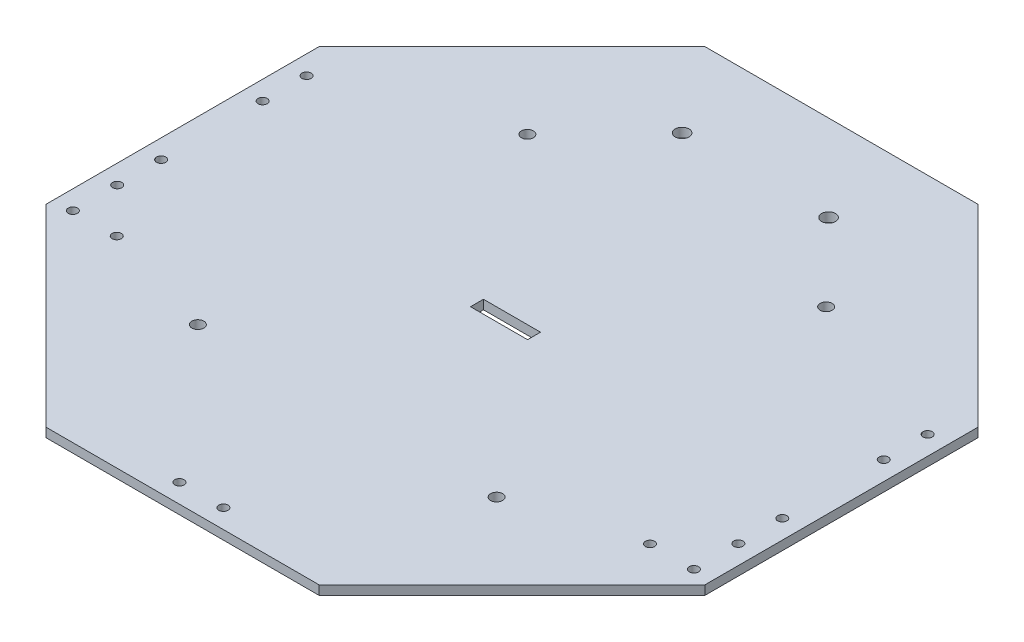
ISO-10303-21;
HEADER;
FILE_DESCRIPTION(('STEP AP214'),'2;1');
FILE_NAME('part.step','',(''),(''),'','','');
FILE_SCHEMA(('AUTOMOTIVE_DESIGN { 1 0 10303 214 1 1 1 1 }'));
ENDSEC;
DATA;
#1=APPLICATION_CONTEXT('core data for automotive mechanical design processes');
#2=APPLICATION_PROTOCOL_DEFINITION('international standard','automotive_design',2000,#1);
#3=PRODUCT_CONTEXT('',#1,'mechanical');
#4=PRODUCT('Part','Part','',(#3));
#5=PRODUCT_RELATED_PRODUCT_CATEGORY('part','',(#4));
#6=PRODUCT_DEFINITION_FORMATION('','',#4);
#7=PRODUCT_DEFINITION_CONTEXT('part definition',#1,'design');
#8=PRODUCT_DEFINITION('design','',#6,#7);
#9=PRODUCT_DEFINITION_SHAPE('','',#8);
#10=(LENGTH_UNIT() NAMED_UNIT(*) SI_UNIT(.MILLI.,.METRE.));
#11=(NAMED_UNIT(*) PLANE_ANGLE_UNIT() SI_UNIT($,.RADIAN.));
#12=(NAMED_UNIT(*) SI_UNIT($,.STERADIAN.) SOLID_ANGLE_UNIT());
#13=UNCERTAINTY_MEASURE_WITH_UNIT(LENGTH_MEASURE(1.E-05),#10,'distance_accuracy_value','');
#14=(GEOMETRIC_REPRESENTATION_CONTEXT(3) GLOBAL_UNCERTAINTY_ASSIGNED_CONTEXT((#13)) GLOBAL_UNIT_ASSIGNED_CONTEXT((#10,
#11,#12)) REPRESENTATION_CONTEXT('',''));
#15=CARTESIAN_POINT('',(0.,0.,0.));
#16=DIRECTION('',(0.,0.,1.));
#17=DIRECTION('',(1.,0.,0.));
#18=AXIS2_PLACEMENT_3D('',#15,#16,#17);
#19=CARTESIAN_POINT('',(0.,3.175,0.));
#20=DIRECTION('',(0.,-1.,0.));
#21=DIRECTION('',(0.,0.,-1.));
#22=AXIS2_PLACEMENT_3D('',#19,#20,#21);
#23=PLANE('',#22);
#24=CARTESIAN_POINT('',(50.8,3.175,-154.263560488309));
#25=DIRECTION('',(0.,1.,0.));
#26=DIRECTION('',(0.,0.,1.));
#27=AXIS2_PLACEMENT_3D('',#24,#25,#26);
#28=CIRCLE('',#27,2.41300000000001);
#29=CARTESIAN_POINT('',(50.8,3.175,-151.850560488309));
#30=VERTEX_POINT('',#29);
#31=EDGE_CURVE('E500',#30,#30,#28,.T.);
#32=ORIENTED_EDGE('',*,*,#31,.F.);
#33=EDGE_LOOP('',(#32));
#34=FACE_BOUND('',#33,.T.);
#35=CARTESIAN_POINT('',(101.6,3.175,-154.263560488309));
#36=DIRECTION('',(0.,1.,0.));
#37=DIRECTION('',(0.,0.,-1.));
#38=AXIS2_PLACEMENT_3D('',#35,#36,#37);
#39=CIRCLE('',#38,2.41300000000001);
#40=CARTESIAN_POINT('',(101.6,3.175,-156.676560488309));
#41=VERTEX_POINT('',#40);
#42=EDGE_CURVE('E146',#41,#41,#39,.T.);
#43=ORIENTED_EDGE('',*,*,#42,.F.);
#44=EDGE_LOOP('',(#43));
#45=FACE_BOUND('',#44,.T.);
#46=DIRECTION('',(1.,0.,0.));
#47=VECTOR('',#46,1.);
#48=CARTESIAN_POINT('',(86.1,3.175,-65.35));
#49=LINE('',#48,#47);
#50=CARTESIAN_POINT('',(66.3,3.175,-65.35));
#51=VERTEX_POINT('',#50);
#52=CARTESIAN_POINT('',(86.1,3.175,-65.35));
#53=VERTEX_POINT('',#52);
#54=EDGE_CURVE('E152',#51,#53,#49,.T.);
#55=ORIENTED_EDGE('',*,*,#54,.F.);
#56=DIRECTION('',(0.,0.,1.));
#57=VECTOR('',#56,1.);
#58=CARTESIAN_POINT('',(66.3,3.175,-69.85));
#59=LINE('',#58,#57);
#60=CARTESIAN_POINT('',(66.3,3.175,-69.85));
#61=VERTEX_POINT('',#60);
#62=EDGE_CURVE('E48',#61,#51,#59,.T.);
#63=ORIENTED_EDGE('',*,*,#62,.F.);
#64=DIRECTION('',(-1.,0.,0.));
#65=VECTOR('',#64,1.);
#66=CARTESIAN_POINT('',(86.1,3.175,-69.85));
#67=LINE('',#66,#65);
#68=CARTESIAN_POINT('',(86.1,3.175,-69.85));
#69=VERTEX_POINT('',#68);
#70=EDGE_CURVE('E140',#69,#61,#67,.T.);
#71=ORIENTED_EDGE('',*,*,#70,.F.);
#72=DIRECTION('',(0.,0.,-1.));
#73=VECTOR('',#72,1.);
#74=CARTESIAN_POINT('',(86.1,3.175,-69.85));
#75=LINE('',#74,#73);
#76=EDGE_CURVE('E143',#53,#69,#75,.T.);
#77=ORIENTED_EDGE('',*,*,#76,.F.);
#78=EDGE_LOOP('',(#55,#63,#71,#77));
#79=FACE_BOUND('',#78,.T.);
#80=CARTESIAN_POINT('',(-31.5214,3.175,-106.313101445706));
#81=DIRECTION('',(0.,1.,0.));
#82=DIRECTION('',(0.,0.,1.));
#83=AXIS2_PLACEMENT_3D('',#80,#81,#82);
#84=CIRCLE('',#83,1.59999999999999);
#85=CARTESIAN_POINT('',(-31.5214,3.175,-104.713101445706));
#86=VERTEX_POINT('',#85);
#87=EDGE_CURVE('E159',#86,#86,#84,.T.);
#88=ORIENTED_EDGE('',*,*,#87,.F.);
#89=EDGE_LOOP('',(#88));
#90=FACE_BOUND('',#89,.T.);
#91=CARTESIAN_POINT('',(-31.5214,3.175,-91.0731014457063));
#92=DIRECTION('',(0.,1.,0.));
#93=DIRECTION('',(0.,0.,1.));
#94=AXIS2_PLACEMENT_3D('',#91,#92,#93);
#95=CIRCLE('',#94,1.59999999999999);
#96=CARTESIAN_POINT('',(-31.5214,3.175,-89.4731014457063));
#97=VERTEX_POINT('',#96);
#98=EDGE_CURVE('E168',#97,#97,#95,.T.);
#99=ORIENTED_EDGE('',*,*,#98,.F.);
#100=EDGE_LOOP('',(#99));
#101=FACE_BOUND('',#100,.T.);
#102=CARTESIAN_POINT('',(-31.5214,3.175,-55.879553600485));
#103=DIRECTION('',(0.,1.,0.));
#104=DIRECTION('',(0.,0.,1.));
#105=AXIS2_PLACEMENT_3D('',#102,#103,#104);
#106=CIRCLE('',#105,1.59999999999999);
#107=CARTESIAN_POINT('',(-31.5214,3.175,-54.2795536004851));
#108=VERTEX_POINT('',#107);
#109=EDGE_CURVE('E174',#108,#108,#106,.T.);
#110=ORIENTED_EDGE('',*,*,#109,.F.);
#111=EDGE_LOOP('',(#110));
#112=FACE_BOUND('',#111,.T.);
#113=CARTESIAN_POINT('',(-31.5214,3.175,-40.6395536004851));
#114=DIRECTION('',(0.,1.,0.));
#115=DIRECTION('',(0.,0.,1.));
#116=AXIS2_PLACEMENT_3D('',#113,#114,#115);
#117=CIRCLE('',#116,1.59999999999999);
#118=CARTESIAN_POINT('',(-31.5214,3.175,-39.0395536004851));
#119=VERTEX_POINT('',#118);
#120=EDGE_CURVE('E180',#119,#119,#117,.T.);
#121=ORIENTED_EDGE('',*,*,#120,.F.);
#122=EDGE_LOOP('',(#121));
#123=FACE_BOUND('',#122,.T.);
#124=CARTESIAN_POINT('',(-31.5214,3.175,-25.2303351621829));
#125=DIRECTION('',(0.,1.,0.));
#126=DIRECTION('',(0.,0.,1.));
#127=AXIS2_PLACEMENT_3D('',#124,#125,#126);
#128=CIRCLE('',#127,1.59999999999999);
#129=CARTESIAN_POINT('',(-31.5214,3.175,-23.6303351621829));
#130=VERTEX_POINT('',#129);
#131=EDGE_CURVE('E186',#130,#130,#128,.T.);
#132=ORIENTED_EDGE('',*,*,#131,.F.);
#133=EDGE_LOOP('',(#132));
#134=FACE_BOUND('',#133,.T.);
#135=CARTESIAN_POINT('',(-16.2814,3.175,-25.2303351621829));
#136=DIRECTION('',(0.,1.,0.));
#137=DIRECTION('',(0.,0.,1.));
#138=AXIS2_PLACEMENT_3D('',#135,#136,#137);
#139=CIRCLE('',#138,1.59999999999999);
#140=CARTESIAN_POINT('',(-16.2814,3.175,-23.6303351621829));
#141=VERTEX_POINT('',#140);
#142=EDGE_CURVE('E192',#141,#141,#139,.T.);
#143=ORIENTED_EDGE('',*,*,#142,.F.);
#144=EDGE_LOOP('',(#143));
#145=FACE_BOUND('',#144,.T.);
#146=CARTESIAN_POINT('',(68.58,3.175,37.8714));
#147=DIRECTION('',(0.,1.,0.));
#148=DIRECTION('',(0.,0.,1.));
#149=AXIS2_PLACEMENT_3D('',#146,#147,#148);
#150=CIRCLE('',#149,1.59999999999999);
#151=CARTESIAN_POINT('',(68.58,3.175,39.4714));
#152=VERTEX_POINT('',#151);
#153=EDGE_CURVE('E198',#152,#152,#150,.T.);
#154=ORIENTED_EDGE('',*,*,#153,.F.);
#155=EDGE_LOOP('',(#154));
#156=FACE_BOUND('',#155,.T.);
#157=CARTESIAN_POINT('',(83.8200000000001,3.175,37.8714));
#158=DIRECTION('',(0.,1.,0.));
#159=DIRECTION('',(0.,0.,1.));
#160=AXIS2_PLACEMENT_3D('',#157,#158,#159);
#161=CIRCLE('',#160,1.59999999999999);
#162=CARTESIAN_POINT('',(83.8200000000001,3.175,39.4714));
#163=VERTEX_POINT('',#162);
#164=EDGE_CURVE('E204',#163,#163,#161,.T.);
#165=ORIENTED_EDGE('',*,*,#164,.F.);
#166=EDGE_LOOP('',(#165));
#167=FACE_BOUND('',#166,.T.);
#168=CARTESIAN_POINT('',(183.9214,3.175,-25.2303351621829));
#169=DIRECTION('',(0.,1.,0.));
#170=DIRECTION('',(0.,0.,1.));
#171=AXIS2_PLACEMENT_3D('',#168,#169,#170);
#172=CIRCLE('',#171,1.59999999999999);
#173=CARTESIAN_POINT('',(183.9214,3.175,-23.6303351621829));
#174=VERTEX_POINT('',#173);
#175=EDGE_CURVE('E210',#174,#174,#172,.T.);
#176=ORIENTED_EDGE('',*,*,#175,.F.);
#177=EDGE_LOOP('',(#176));
#178=FACE_BOUND('',#177,.T.);
#179=CARTESIAN_POINT('',(168.6814,3.175,-25.2303351621829));
#180=DIRECTION('',(0.,1.,0.));
#181=DIRECTION('',(0.,0.,1.));
#182=AXIS2_PLACEMENT_3D('',#179,#180,#181);
#183=CIRCLE('',#182,1.59999999999999);
#184=CARTESIAN_POINT('',(168.6814,3.175,-23.6303351621829));
#185=VERTEX_POINT('',#184);
#186=EDGE_CURVE('E216',#185,#185,#183,.T.);
#187=ORIENTED_EDGE('',*,*,#186,.F.);
#188=EDGE_LOOP('',(#187));
#189=FACE_BOUND('',#188,.T.);
#190=CARTESIAN_POINT('',(183.9214,3.175,-40.639553600485));
#191=DIRECTION('',(0.,1.,0.));
#192=DIRECTION('',(0.,0.,1.));
#193=AXIS2_PLACEMENT_3D('',#190,#191,#192);
#194=CIRCLE('',#193,1.59999999999999);
#195=CARTESIAN_POINT('',(183.9214,3.175,-39.039553600485));
#196=VERTEX_POINT('',#195);
#197=EDGE_CURVE('E222',#196,#196,#194,.T.);
#198=ORIENTED_EDGE('',*,*,#197,.F.);
#199=EDGE_LOOP('',(#198));
#200=FACE_BOUND('',#199,.T.);
#201=CARTESIAN_POINT('',(183.9214,3.175,-55.879553600485));
#202=DIRECTION('',(0.,1.,0.));
#203=DIRECTION('',(0.,0.,1.));
#204=AXIS2_PLACEMENT_3D('',#201,#202,#203);
#205=CIRCLE('',#204,1.59999999999999);
#206=CARTESIAN_POINT('',(183.9214,3.175,-54.279553600485));
#207=VERTEX_POINT('',#206);
#208=EDGE_CURVE('E228',#207,#207,#205,.T.);
#209=ORIENTED_EDGE('',*,*,#208,.F.);
#210=EDGE_LOOP('',(#209));
#211=FACE_BOUND('',#210,.T.);
#212=CARTESIAN_POINT('',(183.9214,3.175,-91.0731014457062));
#213=DIRECTION('',(0.,1.,0.));
#214=DIRECTION('',(0.,0.,1.));
#215=AXIS2_PLACEMENT_3D('',#212,#213,#214);
#216=CIRCLE('',#215,1.59999999999999);
#217=CARTESIAN_POINT('',(183.9214,3.175,-89.4731014457062));
#218=VERTEX_POINT('',#217);
#219=EDGE_CURVE('E234',#218,#218,#216,.T.);
#220=ORIENTED_EDGE('',*,*,#219,.F.);
#221=EDGE_LOOP('',(#220));
#222=FACE_BOUND('',#221,.T.);
#223=CARTESIAN_POINT('',(183.9214,3.175,-106.313101445706));
#224=DIRECTION('',(0.,1.,0.));
#225=DIRECTION('',(0.,0.,1.));
#226=AXIS2_PLACEMENT_3D('',#223,#224,#225);
#227=CIRCLE('',#226,1.59999999999999);
#228=CARTESIAN_POINT('',(183.9214,3.175,-104.713101445706));
#229=VERTEX_POINT('',#228);
#230=EDGE_CURVE('E240',#229,#229,#227,.T.);
#231=ORIENTED_EDGE('',*,*,#230,.F.);
#232=EDGE_LOOP('',(#231));
#233=FACE_BOUND('',#232,.T.);
#234=DIRECTION('',(-0.707106781186548,0.,-0.707106781186548));
#235=VECTOR('',#234,1.);
#236=CARTESIAN_POINT('',(123.544610179245,3.175,-184.15));
#237=LINE('',#236,#235);
#238=CARTESIAN_POINT('',(190.5,3.175,-117.194610179245));
#239=VERTEX_POINT('',#238);
#240=CARTESIAN_POINT('',(123.544610179245,3.175,-184.15));
#241=VERTEX_POINT('',#240);
#242=EDGE_CURVE('E271',#239,#241,#237,.T.);
#243=ORIENTED_EDGE('',*,*,#242,.T.);
#244=DIRECTION('',(-1.,0.,0.));
#245=VECTOR('',#244,1.);
#246=CARTESIAN_POINT('',(28.8553898207553,3.175,-184.15));
#247=LINE('',#246,#245);
#248=CARTESIAN_POINT('',(28.8553898207553,3.175,-184.15));
#249=VERTEX_POINT('',#248);
#250=EDGE_CURVE('E274',#241,#249,#247,.T.);
#251=ORIENTED_EDGE('',*,*,#250,.T.);
#252=DIRECTION('',(-0.707106781186548,0.,0.707106781186547));
#253=VECTOR('',#252,1.);
#254=CARTESIAN_POINT('',(28.8553898207553,3.175,-184.15));
#255=LINE('',#254,#253);
#256=CARTESIAN_POINT('',(-38.1,3.175,-117.194610179245));
#257=VERTEX_POINT('',#256);
#258=EDGE_CURVE('E277',#249,#257,#255,.T.);
#259=ORIENTED_EDGE('',*,*,#258,.T.);
#260=DIRECTION('',(0.,0.,1.));
#261=VECTOR('',#260,1.);
#262=CARTESIAN_POINT('',(-38.1,3.175,-22.5053898207552));
#263=LINE('',#262,#261);
#264=CARTESIAN_POINT('',(-38.1,3.175,-22.5053898207552));
#265=VERTEX_POINT('',#264);
#266=EDGE_CURVE('E279',#257,#265,#263,.T.);
#267=ORIENTED_EDGE('',*,*,#266,.T.);
#268=DIRECTION('',(0.707106781186548,0.,0.707106781186548));
#269=VECTOR('',#268,1.);
#270=CARTESIAN_POINT('',(-38.1,3.175,-22.5053898207552));
#271=LINE('',#270,#269);
#272=CARTESIAN_POINT('',(28.8553898207553,3.175,44.45));
#273=VERTEX_POINT('',#272);
#274=EDGE_CURVE('E281',#265,#273,#271,.T.);
#275=ORIENTED_EDGE('',*,*,#274,.T.);
#276=DIRECTION('',(1.,0.,0.));
#277=VECTOR('',#276,1.);
#278=CARTESIAN_POINT('',(28.8553898207553,3.175,44.45));
#279=LINE('',#278,#277);
#280=CARTESIAN_POINT('',(123.544610179245,3.175,44.45));
#281=VERTEX_POINT('',#280);
#282=EDGE_CURVE('E283',#273,#281,#279,.T.);
#283=ORIENTED_EDGE('',*,*,#282,.T.);
#284=DIRECTION('',(0.707106781186545,0.,-0.70710678118655));
#285=VECTOR('',#284,1.);
#286=CARTESIAN_POINT('',(131.544610179245,3.175,36.45));
#287=LINE('',#286,#285);
#288=CARTESIAN_POINT('',(190.5,3.175,-22.5053898207552));
#289=VERTEX_POINT('',#288);
#290=EDGE_CURVE('E285',#281,#289,#287,.T.);
#291=ORIENTED_EDGE('',*,*,#290,.T.);
#292=DIRECTION('',(0.,0.,-1.));
#293=VECTOR('',#292,1.);
#294=CARTESIAN_POINT('',(190.5,3.175,-22.5053898207552));
#295=LINE('',#294,#293);
#296=EDGE_CURVE('E287',#289,#239,#295,.T.);
#297=ORIENTED_EDGE('',*,*,#296,.T.);
#298=EDGE_LOOP('',(#243,#251,#259,#267,#275,#283,#291,#297));
#299=FACE_BOUND('',#298,.T.);
#300=CARTESIAN_POINT('',(24.384,3.175,-12.7));
#301=DIRECTION('',(0.,1.,0.));
#302=DIRECTION('',(0.,0.,1.));
#303=AXIS2_PLACEMENT_3D('',#300,#301,#302);
#304=CIRCLE('',#303,2.0828);
#305=CARTESIAN_POINT('',(24.384,3.175,-10.6172));
#306=VERTEX_POINT('',#305);
#307=EDGE_CURVE('E265',#306,#306,#304,.T.);
#308=ORIENTED_EDGE('',*,*,#307,.F.);
#309=EDGE_LOOP('',(#308));
#310=FACE_BOUND('',#309,.T.);
#311=CARTESIAN_POINT('',(128.016,3.175,-12.7));
#312=DIRECTION('',(0.,1.,0.));
#313=DIRECTION('',(0.,0.,-1.));
#314=AXIS2_PLACEMENT_3D('',#311,#312,#313);
#315=CIRCLE('',#314,2.08279999999999);
#316=CARTESIAN_POINT('',(128.016,3.175,-14.7828));
#317=VERTEX_POINT('',#316);
#318=EDGE_CURVE('E259',#317,#317,#315,.T.);
#319=ORIENTED_EDGE('',*,*,#318,.F.);
#320=EDGE_LOOP('',(#319));
#321=FACE_BOUND('',#320,.T.);
#322=CARTESIAN_POINT('',(128.016,3.175,-127.));
#323=DIRECTION('',(0.,1.,0.));
#324=DIRECTION('',(0.,0.,1.));
#325=AXIS2_PLACEMENT_3D('',#322,#323,#324);
#326=CIRCLE('',#325,2.08279999999998);
#327=CARTESIAN_POINT('',(128.016,3.175,-124.9172));
#328=VERTEX_POINT('',#327);
#329=EDGE_CURVE('E253',#328,#328,#326,.T.);
#330=ORIENTED_EDGE('',*,*,#329,.F.);
#331=EDGE_LOOP('',(#330));
#332=FACE_BOUND('',#331,.T.);
#333=CARTESIAN_POINT('',(24.384,3.175,-127.));
#334=DIRECTION('',(0.,1.,0.));
#335=DIRECTION('',(0.,0.,-1.));
#336=AXIS2_PLACEMENT_3D('',#333,#334,#335);
#337=CIRCLE('',#336,2.08279999999999);
#338=CARTESIAN_POINT('',(24.384,3.175,-129.0828));
#339=VERTEX_POINT('',#338);
#340=EDGE_CURVE('E247',#339,#339,#337,.T.);
#341=ORIENTED_EDGE('',*,*,#340,.F.);
#342=EDGE_LOOP('',(#341));
#343=FACE_BOUND('',#342,.T.);
#344=ADVANCED_FACE('F33',(#34,#45,#79,#90,#101,#112,#123,#134,#145,#156,#167,#178,#189,#200,
#211,#222,#233,#299,#310,#321,#332,#343),#23,.F.);
#345=CARTESIAN_POINT('',(0.,0.,0.));
#346=DIRECTION('',(0.,-1.,0.));
#347=DIRECTION('',(0.,0.,-1.));
#348=AXIS2_PLACEMENT_3D('',#345,#346,#347);
#349=PLANE('',#348);
#350=CARTESIAN_POINT('',(50.8,0.,-154.263560488309));
#351=DIRECTION('',(0.,1.,0.));
#352=DIRECTION('',(0.,0.,1.));
#353=AXIS2_PLACEMENT_3D('',#350,#351,#352);
#354=CIRCLE('',#353,2.41300000000001);
#355=CARTESIAN_POINT('',(50.8,0.,-151.850560488309));
#356=VERTEX_POINT('',#355);
#357=EDGE_CURVE('E153',#356,#356,#354,.T.);
#358=ORIENTED_EDGE('',*,*,#357,.T.);
#359=EDGE_LOOP('',(#358));
#360=FACE_BOUND('',#359,.T.);
#361=CARTESIAN_POINT('',(101.6,0.,-154.263560488309));
#362=DIRECTION('',(0.,1.,0.));
#363=DIRECTION('',(0.,0.,-1.));
#364=AXIS2_PLACEMENT_3D('',#361,#362,#363);
#365=CIRCLE('',#364,2.41300000000001);
#366=CARTESIAN_POINT('',(101.6,0.,-156.676560488309));
#367=VERTEX_POINT('',#366);
#368=EDGE_CURVE('E501',#367,#367,#365,.T.);
#369=ORIENTED_EDGE('',*,*,#368,.T.);
#370=EDGE_LOOP('',(#369));
#371=FACE_BOUND('',#370,.T.);
#372=DIRECTION('',(0.,0.,1.));
#373=VECTOR('',#372,1.);
#374=CARTESIAN_POINT('',(66.3,0.,-69.85));
#375=LINE('',#374,#373);
#376=CARTESIAN_POINT('',(66.3,0.,-69.85));
#377=VERTEX_POINT('',#376);
#378=CARTESIAN_POINT('',(66.3,0.,-65.35));
#379=VERTEX_POINT('',#378);
#380=EDGE_CURVE('E124',#377,#379,#375,.T.);
#381=ORIENTED_EDGE('',*,*,#380,.T.);
#382=DIRECTION('',(1.,0.,0.));
#383=VECTOR('',#382,1.);
#384=CARTESIAN_POINT('',(86.1,0.,-65.35));
#385=LINE('',#384,#383);
#386=CARTESIAN_POINT('',(86.1,0.,-65.35));
#387=VERTEX_POINT('',#386);
#388=EDGE_CURVE('E133',#379,#387,#385,.T.);
#389=ORIENTED_EDGE('',*,*,#388,.T.);
#390=DIRECTION('',(0.,0.,-1.));
#391=VECTOR('',#390,1.);
#392=CARTESIAN_POINT('',(86.1,0.,-69.85));
#393=LINE('',#392,#391);
#394=CARTESIAN_POINT('',(86.1,0.,-69.85));
#395=VERTEX_POINT('',#394);
#396=EDGE_CURVE('E56',#387,#395,#393,.T.);
#397=ORIENTED_EDGE('',*,*,#396,.T.);
#398=DIRECTION('',(-1.,0.,0.));
#399=VECTOR('',#398,1.);
#400=CARTESIAN_POINT('',(86.1,0.,-69.85));
#401=LINE('',#400,#399);
#402=EDGE_CURVE('E130',#395,#377,#401,.T.);
#403=ORIENTED_EDGE('',*,*,#402,.T.);
#404=EDGE_LOOP('',(#381,#389,#397,#403));
#405=FACE_BOUND('',#404,.T.);
#406=CARTESIAN_POINT('',(-31.5214,0.,-106.313101445706));
#407=DIRECTION('',(0.,1.,0.));
#408=DIRECTION('',(0.,0.,1.));
#409=AXIS2_PLACEMENT_3D('',#406,#407,#408);
#410=CIRCLE('',#409,1.6);
#411=CARTESIAN_POINT('',(-31.5214,0.,-104.713101445706));
#412=VERTEX_POINT('',#411);
#413=EDGE_CURVE('E165',#412,#412,#410,.T.);
#414=ORIENTED_EDGE('',*,*,#413,.T.);
#415=EDGE_LOOP('',(#414));
#416=FACE_BOUND('',#415,.T.);
#417=CARTESIAN_POINT('',(-31.5214,0.,-91.0731014457063));
#418=DIRECTION('',(0.,1.,0.));
#419=DIRECTION('',(0.,0.,1.));
#420=AXIS2_PLACEMENT_3D('',#417,#418,#419);
#421=CIRCLE('',#420,1.6);
#422=CARTESIAN_POINT('',(-31.5214,0.,-89.4731014457063));
#423=VERTEX_POINT('',#422);
#424=EDGE_CURVE('E171',#423,#423,#421,.T.);
#425=ORIENTED_EDGE('',*,*,#424,.T.);
#426=EDGE_LOOP('',(#425));
#427=FACE_BOUND('',#426,.T.);
#428=CARTESIAN_POINT('',(-31.5214,0.,-55.879553600485));
#429=DIRECTION('',(0.,1.,0.));
#430=DIRECTION('',(0.,0.,1.));
#431=AXIS2_PLACEMENT_3D('',#428,#429,#430);
#432=CIRCLE('',#431,1.6);
#433=CARTESIAN_POINT('',(-31.5214,0.,-54.279553600485));
#434=VERTEX_POINT('',#433);
#435=EDGE_CURVE('E177',#434,#434,#432,.T.);
#436=ORIENTED_EDGE('',*,*,#435,.T.);
#437=EDGE_LOOP('',(#436));
#438=FACE_BOUND('',#437,.T.);
#439=CARTESIAN_POINT('',(-31.5214,0.,-40.6395536004851));
#440=DIRECTION('',(0.,1.,0.));
#441=DIRECTION('',(0.,0.,1.));
#442=AXIS2_PLACEMENT_3D('',#439,#440,#441);
#443=CIRCLE('',#442,1.6);
#444=CARTESIAN_POINT('',(-31.5214,0.,-39.0395536004851));
#445=VERTEX_POINT('',#444);
#446=EDGE_CURVE('E183',#445,#445,#443,.T.);
#447=ORIENTED_EDGE('',*,*,#446,.T.);
#448=EDGE_LOOP('',(#447));
#449=FACE_BOUND('',#448,.T.);
#450=CARTESIAN_POINT('',(-31.5214,0.,-25.2303351621829));
#451=DIRECTION('',(0.,1.,0.));
#452=DIRECTION('',(0.,0.,1.));
#453=AXIS2_PLACEMENT_3D('',#450,#451,#452);
#454=CIRCLE('',#453,1.6);
#455=CARTESIAN_POINT('',(-31.5214,0.,-23.6303351621829));
#456=VERTEX_POINT('',#455);
#457=EDGE_CURVE('E189',#456,#456,#454,.T.);
#458=ORIENTED_EDGE('',*,*,#457,.T.);
#459=EDGE_LOOP('',(#458));
#460=FACE_BOUND('',#459,.T.);
#461=CARTESIAN_POINT('',(-16.2814,0.,-25.2303351621829));
#462=DIRECTION('',(0.,1.,0.));
#463=DIRECTION('',(0.,0.,1.));
#464=AXIS2_PLACEMENT_3D('',#461,#462,#463);
#465=CIRCLE('',#464,1.6);
#466=CARTESIAN_POINT('',(-16.2814,0.,-23.6303351621829));
#467=VERTEX_POINT('',#466);
#468=EDGE_CURVE('E195',#467,#467,#465,.T.);
#469=ORIENTED_EDGE('',*,*,#468,.T.);
#470=EDGE_LOOP('',(#469));
#471=FACE_BOUND('',#470,.T.);
#472=CARTESIAN_POINT('',(68.58,0.,37.8714));
#473=DIRECTION('',(0.,1.,0.));
#474=DIRECTION('',(0.,0.,1.));
#475=AXIS2_PLACEMENT_3D('',#472,#473,#474);
#476=CIRCLE('',#475,1.6);
#477=CARTESIAN_POINT('',(68.58,0.,39.4714));
#478=VERTEX_POINT('',#477);
#479=EDGE_CURVE('E201',#478,#478,#476,.T.);
#480=ORIENTED_EDGE('',*,*,#479,.T.);
#481=EDGE_LOOP('',(#480));
#482=FACE_BOUND('',#481,.T.);
#483=CARTESIAN_POINT('',(83.8200000000001,0.,37.8714));
#484=DIRECTION('',(0.,1.,0.));
#485=DIRECTION('',(0.,0.,1.));
#486=AXIS2_PLACEMENT_3D('',#483,#484,#485);
#487=CIRCLE('',#486,1.6);
#488=CARTESIAN_POINT('',(83.8200000000001,0.,39.4714));
#489=VERTEX_POINT('',#488);
#490=EDGE_CURVE('E207',#489,#489,#487,.T.);
#491=ORIENTED_EDGE('',*,*,#490,.T.);
#492=EDGE_LOOP('',(#491));
#493=FACE_BOUND('',#492,.T.);
#494=CARTESIAN_POINT('',(183.9214,0.,-25.2303351621829));
#495=DIRECTION('',(0.,1.,0.));
#496=DIRECTION('',(0.,0.,1.));
#497=AXIS2_PLACEMENT_3D('',#494,#495,#496);
#498=CIRCLE('',#497,1.59999999999999);
#499=CARTESIAN_POINT('',(183.9214,0.,-23.6303351621829));
#500=VERTEX_POINT('',#499);
#501=EDGE_CURVE('E213',#500,#500,#498,.T.);
#502=ORIENTED_EDGE('',*,*,#501,.T.);
#503=EDGE_LOOP('',(#502));
#504=FACE_BOUND('',#503,.T.);
#505=CARTESIAN_POINT('',(168.6814,0.,-25.2303351621829));
#506=DIRECTION('',(0.,1.,0.));
#507=DIRECTION('',(0.,0.,1.));
#508=AXIS2_PLACEMENT_3D('',#505,#506,#507);
#509=CIRCLE('',#508,1.59999999999999);
#510=CARTESIAN_POINT('',(168.6814,0.,-23.6303351621829));
#511=VERTEX_POINT('',#510);
#512=EDGE_CURVE('E219',#511,#511,#509,.T.);
#513=ORIENTED_EDGE('',*,*,#512,.T.);
#514=EDGE_LOOP('',(#513));
#515=FACE_BOUND('',#514,.T.);
#516=CARTESIAN_POINT('',(183.9214,0.,-40.639553600485));
#517=DIRECTION('',(0.,1.,0.));
#518=DIRECTION('',(0.,0.,1.));
#519=AXIS2_PLACEMENT_3D('',#516,#517,#518);
#520=CIRCLE('',#519,1.59999999999999);
#521=CARTESIAN_POINT('',(183.9214,0.,-39.039553600485));
#522=VERTEX_POINT('',#521);
#523=EDGE_CURVE('E225',#522,#522,#520,.T.);
#524=ORIENTED_EDGE('',*,*,#523,.T.);
#525=EDGE_LOOP('',(#524));
#526=FACE_BOUND('',#525,.T.);
#527=CARTESIAN_POINT('',(183.9214,0.,-55.879553600485));
#528=DIRECTION('',(0.,1.,0.));
#529=DIRECTION('',(0.,0.,1.));
#530=AXIS2_PLACEMENT_3D('',#527,#528,#529);
#531=CIRCLE('',#530,1.59999999999999);
#532=CARTESIAN_POINT('',(183.9214,0.,-54.279553600485));
#533=VERTEX_POINT('',#532);
#534=EDGE_CURVE('E231',#533,#533,#531,.T.);
#535=ORIENTED_EDGE('',*,*,#534,.T.);
#536=EDGE_LOOP('',(#535));
#537=FACE_BOUND('',#536,.T.);
#538=CARTESIAN_POINT('',(183.9214,0.,-91.0731014457062));
#539=DIRECTION('',(0.,1.,0.));
#540=DIRECTION('',(0.,0.,1.));
#541=AXIS2_PLACEMENT_3D('',#538,#539,#540);
#542=CIRCLE('',#541,1.59999999999999);
#543=CARTESIAN_POINT('',(183.9214,0.,-89.4731014457062));
#544=VERTEX_POINT('',#543);
#545=EDGE_CURVE('E237',#544,#544,#542,.T.);
#546=ORIENTED_EDGE('',*,*,#545,.T.);
#547=EDGE_LOOP('',(#546));
#548=FACE_BOUND('',#547,.T.);
#549=CARTESIAN_POINT('',(183.9214,0.,-106.313101445706));
#550=DIRECTION('',(0.,1.,0.));
#551=DIRECTION('',(0.,0.,1.));
#552=AXIS2_PLACEMENT_3D('',#549,#550,#551);
#553=CIRCLE('',#552,1.59999999999999);
#554=CARTESIAN_POINT('',(183.9214,0.,-104.713101445706));
#555=VERTEX_POINT('',#554);
#556=EDGE_CURVE('E243',#555,#555,#553,.T.);
#557=ORIENTED_EDGE('',*,*,#556,.T.);
#558=EDGE_LOOP('',(#557));
#559=FACE_BOUND('',#558,.T.);
#560=CARTESIAN_POINT('',(128.016,0.,-127.));
#561=DIRECTION('',(0.,1.,0.));
#562=DIRECTION('',(0.,0.,1.));
#563=AXIS2_PLACEMENT_3D('',#560,#561,#562);
#564=CIRCLE('',#563,2.08279999999998);
#565=CARTESIAN_POINT('',(128.016,0.,-124.9172));
#566=VERTEX_POINT('',#565);
#567=EDGE_CURVE('E250',#566,#566,#564,.T.);
#568=ORIENTED_EDGE('',*,*,#567,.T.);
#569=EDGE_LOOP('',(#568));
#570=FACE_BOUND('',#569,.T.);
#571=CARTESIAN_POINT('',(24.384,0.,-12.7));
#572=DIRECTION('',(0.,1.,0.));
#573=DIRECTION('',(0.,0.,1.));
#574=AXIS2_PLACEMENT_3D('',#571,#572,#573);
#575=CIRCLE('',#574,2.0828);
#576=CARTESIAN_POINT('',(24.384,0.,-10.6172));
#577=VERTEX_POINT('',#576);
#578=EDGE_CURVE('E262',#577,#577,#575,.T.);
#579=ORIENTED_EDGE('',*,*,#578,.T.);
#580=EDGE_LOOP('',(#579));
#581=FACE_BOUND('',#580,.T.);
#582=DIRECTION('',(-1.,0.,0.));
#583=VECTOR('',#582,1.);
#584=CARTESIAN_POINT('',(28.8553898207553,0.,-184.15));
#585=LINE('',#584,#583);
#586=CARTESIAN_POINT('',(123.544610179245,0.,-184.15));
#587=VERTEX_POINT('',#586);
#588=CARTESIAN_POINT('',(28.8553898207553,0.,-184.15));
#589=VERTEX_POINT('',#588);
#590=EDGE_CURVE('E268',#587,#589,#585,.T.);
#591=ORIENTED_EDGE('',*,*,#590,.F.);
#592=DIRECTION('',(-0.707106781186546,0.,-0.707106781186549));
#593=VECTOR('',#592,1.);
#594=CARTESIAN_POINT('',(182.5,0.,-125.194610179245));
#595=LINE('',#594,#593);
#596=CARTESIAN_POINT('',(190.5,0.,-117.194610179245));
#597=VERTEX_POINT('',#596);
#598=EDGE_CURVE('E275',#597,#587,#595,.T.);
#599=ORIENTED_EDGE('',*,*,#598,.F.);
#600=DIRECTION('',(0.,0.,-1.));
#601=VECTOR('',#600,1.);
#602=CARTESIAN_POINT('',(190.5,0.,-22.5053898207552));
#603=LINE('',#602,#601);
#604=CARTESIAN_POINT('',(190.5,0.,-22.5053898207552));
#605=VERTEX_POINT('',#604);
#606=EDGE_CURVE('E305',#605,#597,#603,.T.);
#607=ORIENTED_EDGE('',*,*,#606,.F.);
#608=DIRECTION('',(0.707106781186545,0.,-0.70710678118655));
#609=VECTOR('',#608,1.);
#610=CARTESIAN_POINT('',(190.5,0.,-22.5053898207552));
#611=LINE('',#610,#609);
#612=CARTESIAN_POINT('',(123.544610179245,0.,44.45));
#613=VERTEX_POINT('',#612);
#614=EDGE_CURVE('E303',#613,#605,#611,.T.);
#615=ORIENTED_EDGE('',*,*,#614,.F.);
#616=DIRECTION('',(1.,0.,0.));
#617=VECTOR('',#616,1.);
#618=CARTESIAN_POINT('',(28.8553898207553,0.,44.45));
#619=LINE('',#618,#617);
#620=CARTESIAN_POINT('',(28.8553898207553,0.,44.45));
#621=VERTEX_POINT('',#620);
#622=EDGE_CURVE('E300',#621,#613,#619,.T.);
#623=ORIENTED_EDGE('',*,*,#622,.F.);
#624=DIRECTION('',(0.707106781186548,0.,0.707106781186547));
#625=VECTOR('',#624,1.);
#626=CARTESIAN_POINT('',(20.8553898207552,0.,36.45));
#627=LINE('',#626,#625);
#628=CARTESIAN_POINT('',(-38.1,0.,-22.5053898207552));
#629=VERTEX_POINT('',#628);
#630=EDGE_CURVE('E298',#629,#621,#627,.T.);
#631=ORIENTED_EDGE('',*,*,#630,.F.);
#632=DIRECTION('',(0.,0.,1.));
#633=VECTOR('',#632,1.);
#634=CARTESIAN_POINT('',(-38.1,0.,-22.5053898207552));
#635=LINE('',#634,#633);
#636=CARTESIAN_POINT('',(-38.1,0.,-117.194610179245));
#637=VERTEX_POINT('',#636);
#638=EDGE_CURVE('E295',#637,#629,#635,.T.);
#639=ORIENTED_EDGE('',*,*,#638,.F.);
#640=DIRECTION('',(-0.707106781186549,0.,0.707106781186547));
#641=VECTOR('',#640,1.);
#642=CARTESIAN_POINT('',(-30.1,0.,-125.194610179245));
#643=LINE('',#642,#641);
#644=EDGE_CURVE('E293',#589,#637,#643,.T.);
#645=ORIENTED_EDGE('',*,*,#644,.F.);
#646=EDGE_LOOP('',(#591,#599,#607,#615,#623,#631,#639,#645));
#647=FACE_BOUND('',#646,.T.);
#648=CARTESIAN_POINT('',(128.016,0.,-12.7));
#649=DIRECTION('',(0.,1.,0.));
#650=DIRECTION('',(0.,0.,-1.));
#651=AXIS2_PLACEMENT_3D('',#648,#649,#650);
#652=CIRCLE('',#651,2.08279999999999);
#653=CARTESIAN_POINT('',(128.016,0.,-14.7828));
#654=VERTEX_POINT('',#653);
#655=EDGE_CURVE('E256',#654,#654,#652,.T.);
#656=ORIENTED_EDGE('',*,*,#655,.T.);
#657=EDGE_LOOP('',(#656));
#658=FACE_BOUND('',#657,.T.);
#659=CARTESIAN_POINT('',(24.384,0.,-127.));
#660=DIRECTION('',(0.,1.,0.));
#661=DIRECTION('',(0.,0.,-1.));
#662=AXIS2_PLACEMENT_3D('',#659,#660,#661);
#663=CIRCLE('',#662,2.08279999999999);
#664=CARTESIAN_POINT('',(24.384,0.,-129.0828));
#665=VERTEX_POINT('',#664);
#666=EDGE_CURVE('E246',#665,#665,#663,.T.);
#667=ORIENTED_EDGE('',*,*,#666,.T.);
#668=EDGE_LOOP('',(#667));
#669=FACE_BOUND('',#668,.T.);
#670=ADVANCED_FACE('F137',(#360,#371,#405,#416,#427,#438,#449,#460,#471,#482,#493,#504,#515,
#526,#537,#548,#559,#570,#581,#647,#658,#669),#349,.T.);
#671=CARTESIAN_POINT('',(28.8553898207553,3.175,-184.15));
#672=DIRECTION('',(0.,0.,1.));
#673=DIRECTION('',(1.,0.,0.));
#674=AXIS2_PLACEMENT_3D('',#671,#672,#673);
#675=PLANE('',#674);
#676=ORIENTED_EDGE('',*,*,#590,.T.);
#677=DIRECTION('',(0.,-1.,0.));
#678=VECTOR('',#677,1.);
#679=CARTESIAN_POINT('',(28.8553898207553,3.175,-184.15));
#680=LINE('',#679,#678);
#681=EDGE_CURVE('E41',#249,#589,#680,.T.);
#682=ORIENTED_EDGE('',*,*,#681,.F.);
#683=ORIENTED_EDGE('',*,*,#250,.F.);
#684=DIRECTION('',(0.,-1.,0.));
#685=VECTOR('',#684,1.);
#686=CARTESIAN_POINT('',(123.544610179245,3.175,-184.15));
#687=LINE('',#686,#685);
#688=EDGE_CURVE('E11',#241,#587,#687,.T.);
#689=ORIENTED_EDGE('',*,*,#688,.T.);
#690=EDGE_LOOP('',(#676,#682,#683,#689));
#691=FACE_BOUND('',#690,.T.);
#692=ADVANCED_FACE('F35',(#691),#675,.F.);
#693=CARTESIAN_POINT('',(-30.1,3.175,-125.194610179245));
#694=DIRECTION('',(0.707106781186547,0.,0.707106781186548));
#695=DIRECTION('',(0.707106781186548,0.,-0.707106781186547));
#696=AXIS2_PLACEMENT_3D('',#693,#694,#695);
#697=PLANE('',#696);
#698=ORIENTED_EDGE('',*,*,#644,.T.);
#699=DIRECTION('',(0.,-1.,0.));
#700=VECTOR('',#699,1.);
#701=CARTESIAN_POINT('',(-38.1,3.175,-117.194610179245));
#702=LINE('',#701,#700);
#703=EDGE_CURVE('E323',#257,#637,#702,.T.);
#704=ORIENTED_EDGE('',*,*,#703,.F.);
#705=ORIENTED_EDGE('',*,*,#258,.F.);
#706=ORIENTED_EDGE('',*,*,#681,.T.);
#707=EDGE_LOOP('',(#698,#704,#705,#706));
#708=FACE_BOUND('',#707,.T.);
#709=ADVANCED_FACE('F329',(#708),#697,.F.);
#710=CARTESIAN_POINT('',(-38.1,3.175,-22.5053898207552));
#711=DIRECTION('',(1.,0.,0.));
#712=DIRECTION('',(0.,0.,-1.));
#713=AXIS2_PLACEMENT_3D('',#710,#711,#712);
#714=PLANE('',#713);
#715=ORIENTED_EDGE('',*,*,#638,.T.);
#716=DIRECTION('',(0.,-1.,0.));
#717=VECTOR('',#716,1.);
#718=CARTESIAN_POINT('',(-38.1,3.175,-22.5053898207552));
#719=LINE('',#718,#717);
#720=EDGE_CURVE('E320',#265,#629,#719,.T.);
#721=ORIENTED_EDGE('',*,*,#720,.F.);
#722=ORIENTED_EDGE('',*,*,#266,.F.);
#723=ORIENTED_EDGE('',*,*,#703,.T.);
#724=EDGE_LOOP('',(#715,#721,#722,#723));
#725=FACE_BOUND('',#724,.T.);
#726=ADVANCED_FACE('F341',(#725),#714,.F.);
#727=CARTESIAN_POINT('',(20.8553898207552,3.175,36.45));
#728=DIRECTION('',(0.707106781186547,0.,-0.707106781186548));
#729=DIRECTION('',(-0.707106781186548,0.,-0.707106781186547));
#730=AXIS2_PLACEMENT_3D('',#727,#728,#729);
#731=PLANE('',#730);
#732=ORIENTED_EDGE('',*,*,#630,.T.);
#733=DIRECTION('',(0.,-1.,0.));
#734=VECTOR('',#733,1.);
#735=CARTESIAN_POINT('',(28.8553898207553,3.175,44.45));
#736=LINE('',#735,#734);
#737=EDGE_CURVE('E317',#273,#621,#736,.T.);
#738=ORIENTED_EDGE('',*,*,#737,.F.);
#739=ORIENTED_EDGE('',*,*,#274,.F.);
#740=ORIENTED_EDGE('',*,*,#720,.T.);
#741=EDGE_LOOP('',(#732,#738,#739,#740));
#742=FACE_BOUND('',#741,.T.);
#743=ADVANCED_FACE('F345',(#742),#731,.F.);
#744=CARTESIAN_POINT('',(28.8553898207553,3.175,44.45));
#745=DIRECTION('',(0.,0.,-1.));
#746=DIRECTION('',(-1.,0.,0.));
#747=AXIS2_PLACEMENT_3D('',#744,#745,#746);
#748=PLANE('',#747);
#749=ORIENTED_EDGE('',*,*,#622,.T.);
#750=DIRECTION('',(0.,-1.,0.));
#751=VECTOR('',#750,1.);
#752=CARTESIAN_POINT('',(123.544610179245,3.175,44.45));
#753=LINE('',#752,#751);
#754=EDGE_CURVE('E314',#281,#613,#753,.T.);
#755=ORIENTED_EDGE('',*,*,#754,.F.);
#756=ORIENTED_EDGE('',*,*,#282,.F.);
#757=ORIENTED_EDGE('',*,*,#737,.T.);
#758=EDGE_LOOP('',(#749,#755,#756,#757));
#759=FACE_BOUND('',#758,.T.);
#760=ADVANCED_FACE('F360',(#759),#748,.F.);
#761=CARTESIAN_POINT('',(190.5,3.175,-22.5053898207552));
#762=DIRECTION('',(-0.70710678118655,0.,-0.707106781186545));
#763=DIRECTION('',(-0.707106781186545,0.,0.70710678118655));
#764=AXIS2_PLACEMENT_3D('',#761,#762,#763);
#765=PLANE('',#764);
#766=ORIENTED_EDGE('',*,*,#614,.T.);
#767=DIRECTION('',(0.,-1.,0.));
#768=VECTOR('',#767,1.);
#769=CARTESIAN_POINT('',(190.5,3.175,-22.5053898207552));
#770=LINE('',#769,#768);
#771=EDGE_CURVE('E311',#289,#605,#770,.T.);
#772=ORIENTED_EDGE('',*,*,#771,.F.);
#773=ORIENTED_EDGE('',*,*,#290,.F.);
#774=ORIENTED_EDGE('',*,*,#754,.T.);
#775=EDGE_LOOP('',(#766,#772,#773,#774));
#776=FACE_BOUND('',#775,.T.);
#777=ADVANCED_FACE('F362',(#776),#765,.F.);
#778=CARTESIAN_POINT('',(190.5,3.175,-22.5053898207552));
#779=DIRECTION('',(-1.,0.,0.));
#780=DIRECTION('',(0.,0.,1.));
#781=AXIS2_PLACEMENT_3D('',#778,#779,#780);
#782=PLANE('',#781);
#783=ORIENTED_EDGE('',*,*,#606,.T.);
#784=DIRECTION('',(0.,-1.,0.));
#785=VECTOR('',#784,1.);
#786=CARTESIAN_POINT('',(190.5,3.175,-117.194610179245));
#787=LINE('',#786,#785);
#788=EDGE_CURVE('E290',#239,#597,#787,.T.);
#789=ORIENTED_EDGE('',*,*,#788,.F.);
#790=ORIENTED_EDGE('',*,*,#296,.F.);
#791=ORIENTED_EDGE('',*,*,#771,.T.);
#792=EDGE_LOOP('',(#783,#789,#790,#791));
#793=FACE_BOUND('',#792,.T.);
#794=ADVANCED_FACE('F356',(#793),#782,.F.);
#795=CARTESIAN_POINT('',(182.5,3.175,-125.194610179245));
#796=DIRECTION('',(-0.707106781186549,0.,0.707106781186546));
#797=DIRECTION('',(0.707106781186546,0.,0.707106781186549));
#798=AXIS2_PLACEMENT_3D('',#795,#796,#797);
#799=PLANE('',#798);
#800=ORIENTED_EDGE('',*,*,#598,.T.);
#801=ORIENTED_EDGE('',*,*,#688,.F.);
#802=ORIENTED_EDGE('',*,*,#242,.F.);
#803=ORIENTED_EDGE('',*,*,#788,.T.);
#804=EDGE_LOOP('',(#800,#801,#802,#803));
#805=FACE_BOUND('',#804,.T.);
#806=ADVANCED_FACE('F354',(#805),#799,.F.);
#807=CARTESIAN_POINT('',(24.384,3.175,-12.7));
#808=DIRECTION('',(0.,-1.,0.));
#809=DIRECTION('',(0.,0.,-1.));
#810=AXIS2_PLACEMENT_3D('',#807,#808,#809);
#811=CYLINDRICAL_SURFACE('',#810,2.0828);
#812=ORIENTED_EDGE('',*,*,#307,.T.);
#813=EDGE_LOOP('',(#812));
#814=FACE_BOUND('',#813,.T.);
#815=ORIENTED_EDGE('',*,*,#578,.F.);
#816=EDGE_LOOP('',(#815));
#817=FACE_BOUND('',#816,.T.);
#818=ADVANCED_FACE('F383',(#814,#817),#811,.F.);
#819=CARTESIAN_POINT('',(128.016,3.175,-12.7));
#820=DIRECTION('',(0.,-1.,0.));
#821=DIRECTION('',(0.,0.,-1.));
#822=AXIS2_PLACEMENT_3D('',#819,#820,#821);
#823=CYLINDRICAL_SURFACE('',#822,2.08279999999999);
#824=ORIENTED_EDGE('',*,*,#318,.T.);
#825=EDGE_LOOP('',(#824));
#826=FACE_BOUND('',#825,.T.);
#827=ORIENTED_EDGE('',*,*,#655,.F.);
#828=EDGE_LOOP('',(#827));
#829=FACE_BOUND('',#828,.T.);
#830=ADVANCED_FACE('F390',(#826,#829),#823,.F.);
#831=CARTESIAN_POINT('',(128.016,3.175,-127.));
#832=DIRECTION('',(0.,-1.,0.));
#833=DIRECTION('',(0.,0.,-1.));
#834=AXIS2_PLACEMENT_3D('',#831,#832,#833);
#835=CYLINDRICAL_SURFACE('',#834,2.08279999999998);
#836=ORIENTED_EDGE('',*,*,#329,.T.);
#837=EDGE_LOOP('',(#836));
#838=FACE_BOUND('',#837,.T.);
#839=ORIENTED_EDGE('',*,*,#567,.F.);
#840=EDGE_LOOP('',(#839));
#841=FACE_BOUND('',#840,.T.);
#842=ADVANCED_FACE('F395',(#838,#841),#835,.F.);
#843=CARTESIAN_POINT('',(24.384,3.175,-127.));
#844=DIRECTION('',(0.,-1.,0.));
#845=DIRECTION('',(0.,0.,-1.));
#846=AXIS2_PLACEMENT_3D('',#843,#844,#845);
#847=CYLINDRICAL_SURFACE('',#846,2.08279999999999);
#848=ORIENTED_EDGE('',*,*,#340,.T.);
#849=EDGE_LOOP('',(#848));
#850=FACE_BOUND('',#849,.T.);
#851=ORIENTED_EDGE('',*,*,#666,.F.);
#852=EDGE_LOOP('',(#851));
#853=FACE_BOUND('',#852,.T.);
#854=ADVANCED_FACE('F408',(#850,#853),#847,.F.);
#855=CARTESIAN_POINT('',(183.9214,3.175,-106.313101445706));
#856=DIRECTION('',(0.,1.,0.));
#857=DIRECTION('',(0.,0.,1.));
#858=AXIS2_PLACEMENT_3D('',#855,#856,#857);
#859=CYLINDRICAL_SURFACE('',#858,1.59999999999999);
#860=ORIENTED_EDGE('',*,*,#556,.F.);
#861=EDGE_LOOP('',(#860));
#862=FACE_BOUND('',#861,.T.);
#863=ORIENTED_EDGE('',*,*,#230,.T.);
#864=EDGE_LOOP('',(#863));
#865=FACE_BOUND('',#864,.T.);
#866=ADVANCED_FACE('F411',(#862,#865),#859,.F.);
#867=CARTESIAN_POINT('',(183.9214,3.175,-91.0731014457062));
#868=DIRECTION('',(0.,1.,0.));
#869=DIRECTION('',(0.,0.,1.));
#870=AXIS2_PLACEMENT_3D('',#867,#868,#869);
#871=CYLINDRICAL_SURFACE('',#870,1.59999999999999);
#872=ORIENTED_EDGE('',*,*,#545,.F.);
#873=EDGE_LOOP('',(#872));
#874=FACE_BOUND('',#873,.T.);
#875=ORIENTED_EDGE('',*,*,#219,.T.);
#876=EDGE_LOOP('',(#875));
#877=FACE_BOUND('',#876,.T.);
#878=ADVANCED_FACE('F419',(#874,#877),#871,.F.);
#879=CARTESIAN_POINT('',(183.9214,3.175,-55.879553600485));
#880=DIRECTION('',(0.,1.,0.));
#881=DIRECTION('',(0.,0.,1.));
#882=AXIS2_PLACEMENT_3D('',#879,#880,#881);
#883=CYLINDRICAL_SURFACE('',#882,1.59999999999999);
#884=ORIENTED_EDGE('',*,*,#534,.F.);
#885=EDGE_LOOP('',(#884));
#886=FACE_BOUND('',#885,.T.);
#887=ORIENTED_EDGE('',*,*,#208,.T.);
#888=EDGE_LOOP('',(#887));
#889=FACE_BOUND('',#888,.T.);
#890=ADVANCED_FACE('F427',(#886,#889),#883,.F.);
#891=CARTESIAN_POINT('',(183.9214,3.175,-40.639553600485));
#892=DIRECTION('',(0.,1.,0.));
#893=DIRECTION('',(0.,0.,1.));
#894=AXIS2_PLACEMENT_3D('',#891,#892,#893);
#895=CYLINDRICAL_SURFACE('',#894,1.59999999999999);
#896=ORIENTED_EDGE('',*,*,#523,.F.);
#897=EDGE_LOOP('',(#896));
#898=FACE_BOUND('',#897,.T.);
#899=ORIENTED_EDGE('',*,*,#197,.T.);
#900=EDGE_LOOP('',(#899));
#901=FACE_BOUND('',#900,.T.);
#902=ADVANCED_FACE('F431',(#898,#901),#895,.F.);
#903=CARTESIAN_POINT('',(168.6814,3.175,-25.2303351621829));
#904=DIRECTION('',(0.,1.,0.));
#905=DIRECTION('',(0.,0.,1.));
#906=AXIS2_PLACEMENT_3D('',#903,#904,#905);
#907=CYLINDRICAL_SURFACE('',#906,1.59999999999999);
#908=ORIENTED_EDGE('',*,*,#512,.F.);
#909=EDGE_LOOP('',(#908));
#910=FACE_BOUND('',#909,.T.);
#911=ORIENTED_EDGE('',*,*,#186,.T.);
#912=EDGE_LOOP('',(#911));
#913=FACE_BOUND('',#912,.T.);
#914=ADVANCED_FACE('F435',(#910,#913),#907,.F.);
#915=CARTESIAN_POINT('',(183.9214,3.175,-25.2303351621829));
#916=DIRECTION('',(0.,1.,0.));
#917=DIRECTION('',(0.,0.,1.));
#918=AXIS2_PLACEMENT_3D('',#915,#916,#917);
#919=CYLINDRICAL_SURFACE('',#918,1.59999999999999);
#920=ORIENTED_EDGE('',*,*,#501,.F.);
#921=EDGE_LOOP('',(#920));
#922=FACE_BOUND('',#921,.T.);
#923=ORIENTED_EDGE('',*,*,#175,.T.);
#924=EDGE_LOOP('',(#923));
#925=FACE_BOUND('',#924,.T.);
#926=ADVANCED_FACE('F439',(#922,#925),#919,.F.);
#927=CARTESIAN_POINT('',(83.8200000000001,3.175,37.8714));
#928=DIRECTION('',(0.,1.,0.));
#929=DIRECTION('',(0.,0.,1.));
#930=AXIS2_PLACEMENT_3D('',#927,#928,#929);
#931=CYLINDRICAL_SURFACE('',#930,1.6);
#932=ORIENTED_EDGE('',*,*,#490,.F.);
#933=EDGE_LOOP('',(#932));
#934=FACE_BOUND('',#933,.T.);
#935=ORIENTED_EDGE('',*,*,#164,.T.);
#936=EDGE_LOOP('',(#935));
#937=FACE_BOUND('',#936,.T.);
#938=ADVANCED_FACE('F443',(#934,#937),#931,.F.);
#939=CARTESIAN_POINT('',(68.58,3.175,37.8714));
#940=DIRECTION('',(0.,1.,0.));
#941=DIRECTION('',(0.,0.,1.));
#942=AXIS2_PLACEMENT_3D('',#939,#940,#941);
#943=CYLINDRICAL_SURFACE('',#942,1.6);
#944=ORIENTED_EDGE('',*,*,#479,.F.);
#945=EDGE_LOOP('',(#944));
#946=FACE_BOUND('',#945,.T.);
#947=ORIENTED_EDGE('',*,*,#153,.T.);
#948=EDGE_LOOP('',(#947));
#949=FACE_BOUND('',#948,.T.);
#950=ADVANCED_FACE('F447',(#946,#949),#943,.F.);
#951=CARTESIAN_POINT('',(-16.2814,3.175,-25.2303351621829));
#952=DIRECTION('',(0.,1.,0.));
#953=DIRECTION('',(0.,0.,1.));
#954=AXIS2_PLACEMENT_3D('',#951,#952,#953);
#955=CYLINDRICAL_SURFACE('',#954,1.59999999999999);
#956=ORIENTED_EDGE('',*,*,#468,.F.);
#957=EDGE_LOOP('',(#956));
#958=FACE_BOUND('',#957,.T.);
#959=ORIENTED_EDGE('',*,*,#142,.T.);
#960=EDGE_LOOP('',(#959));
#961=FACE_BOUND('',#960,.T.);
#962=ADVANCED_FACE('F451',(#958,#961),#955,.F.);
#963=CARTESIAN_POINT('',(-31.5214,3.175,-25.2303351621829));
#964=DIRECTION('',(0.,1.,0.));
#965=DIRECTION('',(0.,0.,1.));
#966=AXIS2_PLACEMENT_3D('',#963,#964,#965);
#967=CYLINDRICAL_SURFACE('',#966,1.59999999999999);
#968=ORIENTED_EDGE('',*,*,#457,.F.);
#969=EDGE_LOOP('',(#968));
#970=FACE_BOUND('',#969,.T.);
#971=ORIENTED_EDGE('',*,*,#131,.T.);
#972=EDGE_LOOP('',(#971));
#973=FACE_BOUND('',#972,.T.);
#974=ADVANCED_FACE('F455',(#970,#973),#967,.F.);
#975=CARTESIAN_POINT('',(-31.5214,3.175,-40.6395536004851));
#976=DIRECTION('',(0.,1.,0.));
#977=DIRECTION('',(0.,0.,1.));
#978=AXIS2_PLACEMENT_3D('',#975,#976,#977);
#979=CYLINDRICAL_SURFACE('',#978,1.59999999999999);
#980=ORIENTED_EDGE('',*,*,#446,.F.);
#981=EDGE_LOOP('',(#980));
#982=FACE_BOUND('',#981,.T.);
#983=ORIENTED_EDGE('',*,*,#120,.T.);
#984=EDGE_LOOP('',(#983));
#985=FACE_BOUND('',#984,.T.);
#986=ADVANCED_FACE('F459',(#982,#985),#979,.F.);
#987=CARTESIAN_POINT('',(-31.5214,3.175,-55.879553600485));
#988=DIRECTION('',(0.,1.,0.));
#989=DIRECTION('',(0.,0.,1.));
#990=AXIS2_PLACEMENT_3D('',#987,#988,#989);
#991=CYLINDRICAL_SURFACE('',#990,1.59999999999999);
#992=ORIENTED_EDGE('',*,*,#435,.F.);
#993=EDGE_LOOP('',(#992));
#994=FACE_BOUND('',#993,.T.);
#995=ORIENTED_EDGE('',*,*,#109,.T.);
#996=EDGE_LOOP('',(#995));
#997=FACE_BOUND('',#996,.T.);
#998=ADVANCED_FACE('F463',(#994,#997),#991,.F.);
#999=CARTESIAN_POINT('',(-31.5214,3.175,-91.0731014457063));
#1000=DIRECTION('',(0.,1.,0.));
#1001=DIRECTION('',(0.,0.,1.));
#1002=AXIS2_PLACEMENT_3D('',#999,#1000,#1001);
#1003=CYLINDRICAL_SURFACE('',#1002,1.59999999999999);
#1004=ORIENTED_EDGE('',*,*,#424,.F.);
#1005=EDGE_LOOP('',(#1004));
#1006=FACE_BOUND('',#1005,.T.);
#1007=ORIENTED_EDGE('',*,*,#98,.T.);
#1008=EDGE_LOOP('',(#1007));
#1009=FACE_BOUND('',#1008,.T.);
#1010=ADVANCED_FACE('F467',(#1006,#1009),#1003,.F.);
#1011=CARTESIAN_POINT('',(-31.5214,3.175,-106.313101445706));
#1012=DIRECTION('',(0.,1.,0.));
#1013=DIRECTION('',(0.,0.,1.));
#1014=AXIS2_PLACEMENT_3D('',#1011,#1012,#1013);
#1015=CYLINDRICAL_SURFACE('',#1014,1.59999999999999);
#1016=ORIENTED_EDGE('',*,*,#413,.F.);
#1017=EDGE_LOOP('',(#1016));
#1018=FACE_BOUND('',#1017,.T.);
#1019=ORIENTED_EDGE('',*,*,#87,.T.);
#1020=EDGE_LOOP('',(#1019));
#1021=FACE_BOUND('',#1020,.T.);
#1022=ADVANCED_FACE('F471',(#1018,#1021),#1015,.F.);
#1023=CARTESIAN_POINT('',(66.3,0.,-69.85));
#1024=DIRECTION('',(-1.,0.,0.));
#1025=DIRECTION('',(0.,0.,1.));
#1026=AXIS2_PLACEMENT_3D('',#1023,#1024,#1025);
#1027=PLANE('',#1026);
#1028=ORIENTED_EDGE('',*,*,#62,.T.);
#1029=DIRECTION('',(0.,1.,0.));
#1030=VECTOR('',#1029,1.);
#1031=CARTESIAN_POINT('',(66.3,0.,-65.35));
#1032=LINE('',#1031,#1030);
#1033=EDGE_CURVE('E120',#379,#51,#1032,.T.);
#1034=ORIENTED_EDGE('',*,*,#1033,.F.);
#1035=ORIENTED_EDGE('',*,*,#380,.F.);
#1036=DIRECTION('',(0.,1.,0.));
#1037=VECTOR('',#1036,1.);
#1038=CARTESIAN_POINT('',(66.3,0.,-69.85));
#1039=LINE('',#1038,#1037);
#1040=EDGE_CURVE('E157',#377,#61,#1039,.T.);
#1041=ORIENTED_EDGE('',*,*,#1040,.T.);
#1042=EDGE_LOOP('',(#1028,#1034,#1035,#1041));
#1043=FACE_BOUND('',#1042,.T.);
#1044=ADVANCED_FACE('F122',(#1043),#1027,.F.);
#1045=CARTESIAN_POINT('',(86.1,0.,-69.85));
#1046=DIRECTION('',(0.,0.,-1.));
#1047=DIRECTION('',(-1.,0.,0.));
#1048=AXIS2_PLACEMENT_3D('',#1045,#1046,#1047);
#1049=PLANE('',#1048);
#1050=ORIENTED_EDGE('',*,*,#70,.T.);
#1051=ORIENTED_EDGE('',*,*,#1040,.F.);
#1052=ORIENTED_EDGE('',*,*,#402,.F.);
#1053=DIRECTION('',(0.,1.,0.));
#1054=VECTOR('',#1053,1.);
#1055=CARTESIAN_POINT('',(86.1,0.,-69.85));
#1056=LINE('',#1055,#1054);
#1057=EDGE_CURVE('E160',#395,#69,#1056,.T.);
#1058=ORIENTED_EDGE('',*,*,#1057,.T.);
#1059=EDGE_LOOP('',(#1050,#1051,#1052,#1058));
#1060=FACE_BOUND('',#1059,.T.);
#1061=ADVANCED_FACE('F478',(#1060),#1049,.F.);
#1062=CARTESIAN_POINT('',(86.1,0.,-69.85));
#1063=DIRECTION('',(1.,0.,0.));
#1064=DIRECTION('',(0.,0.,-1.));
#1065=AXIS2_PLACEMENT_3D('',#1062,#1063,#1064);
#1066=PLANE('',#1065);
#1067=ORIENTED_EDGE('',*,*,#76,.T.);
#1068=ORIENTED_EDGE('',*,*,#1057,.F.);
#1069=ORIENTED_EDGE('',*,*,#396,.F.);
#1070=DIRECTION('',(0.,1.,0.));
#1071=VECTOR('',#1070,1.);
#1072=CARTESIAN_POINT('',(86.1,0.,-65.35));
#1073=LINE('',#1072,#1071);
#1074=EDGE_CURVE('E129',#387,#53,#1073,.T.);
#1075=ORIENTED_EDGE('',*,*,#1074,.T.);
#1076=EDGE_LOOP('',(#1067,#1068,#1069,#1075));
#1077=FACE_BOUND('',#1076,.T.);
#1078=ADVANCED_FACE('F482',(#1077),#1066,.F.);
#1079=CARTESIAN_POINT('',(86.1,0.,-65.35));
#1080=DIRECTION('',(0.,0.,1.));
#1081=DIRECTION('',(1.,0.,0.));
#1082=AXIS2_PLACEMENT_3D('',#1079,#1080,#1081);
#1083=PLANE('',#1082);
#1084=ORIENTED_EDGE('',*,*,#54,.T.);
#1085=ORIENTED_EDGE('',*,*,#1074,.F.);
#1086=ORIENTED_EDGE('',*,*,#388,.F.);
#1087=ORIENTED_EDGE('',*,*,#1033,.T.);
#1088=EDGE_LOOP('',(#1084,#1085,#1086,#1087));
#1089=FACE_BOUND('',#1088,.T.);
#1090=ADVANCED_FACE('F134',(#1089),#1083,.F.);
#1091=CARTESIAN_POINT('',(101.6,0.,-154.263560488309));
#1092=DIRECTION('',(0.,1.,0.));
#1093=DIRECTION('',(0.,0.,1.));
#1094=AXIS2_PLACEMENT_3D('',#1091,#1092,#1093);
#1095=CYLINDRICAL_SURFACE('',#1094,2.41300000000001);
#1096=ORIENTED_EDGE('',*,*,#368,.F.);
#1097=EDGE_LOOP('',(#1096));
#1098=FACE_BOUND('',#1097,.T.);
#1099=ORIENTED_EDGE('',*,*,#42,.T.);
#1100=EDGE_LOOP('',(#1099));
#1101=FACE_BOUND('',#1100,.T.);
#1102=ADVANCED_FACE('F481',(#1098,#1101),#1095,.F.);
#1103=CARTESIAN_POINT('',(50.8,0.,-154.263560488309));
#1104=DIRECTION('',(0.,1.,0.));
#1105=DIRECTION('',(0.,0.,1.));
#1106=AXIS2_PLACEMENT_3D('',#1103,#1104,#1105);
#1107=CYLINDRICAL_SURFACE('',#1106,2.41300000000001);
#1108=ORIENTED_EDGE('',*,*,#357,.F.);
#1109=EDGE_LOOP('',(#1108));
#1110=FACE_BOUND('',#1109,.T.);
#1111=ORIENTED_EDGE('',*,*,#31,.T.);
#1112=EDGE_LOOP('',(#1111));
#1113=FACE_BOUND('',#1112,.T.);
#1114=ADVANCED_FACE('F490',(#1110,#1113),#1107,.F.);
#1115=CLOSED_SHELL('',(#344,#670,#692,#709,#726,#743,#760,#777,#794,#806,#818,#830,#842,#854,
#866,#878,#890,#902,#914,#926,#938,#950,#962,#974,#986,#998,#1010,#1022,#1044,#1061,#1078,#1090,
#1102,#1114));
#1116=MANIFOLD_SOLID_BREP('B2',#1115);
#1117=ADVANCED_BREP_SHAPE_REPRESENTATION('',(#18,#1116),#14);
#1118=SHAPE_DEFINITION_REPRESENTATION(#9,#1117);
ENDSEC;
END-ISO-10303-21;
